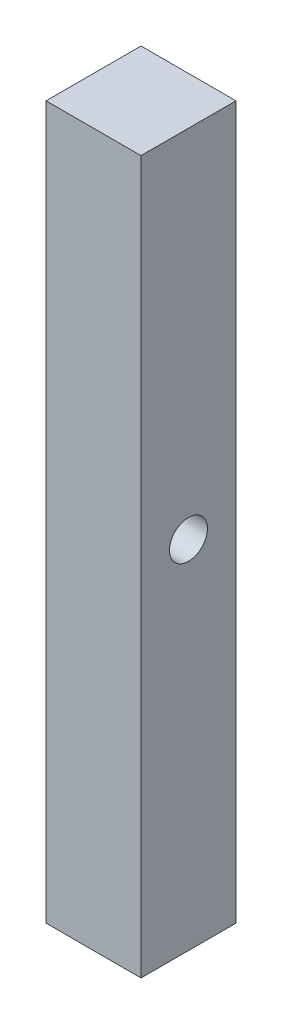
ISO-10303-21;
HEADER;
FILE_DESCRIPTION(('STEP AP214'),'2;1');
FILE_NAME('part.step','',(''),(''),'','','');
FILE_SCHEMA(('AUTOMOTIVE_DESIGN { 1 0 10303 214 1 1 1 1 }'));
ENDSEC;
DATA;
#1=APPLICATION_CONTEXT('core data for automotive mechanical design processes');
#2=APPLICATION_PROTOCOL_DEFINITION('international standard','automotive_design',2000,#1);
#3=PRODUCT_CONTEXT('',#1,'mechanical');
#4=PRODUCT('Part','Part','',(#3));
#5=PRODUCT_RELATED_PRODUCT_CATEGORY('part','',(#4));
#6=PRODUCT_DEFINITION_FORMATION('','',#4);
#7=PRODUCT_DEFINITION_CONTEXT('part definition',#1,'design');
#8=PRODUCT_DEFINITION('design','',#6,#7);
#9=PRODUCT_DEFINITION_SHAPE('','',#8);
#10=(LENGTH_UNIT() NAMED_UNIT(*) SI_UNIT(.MILLI.,.METRE.));
#11=(NAMED_UNIT(*) PLANE_ANGLE_UNIT() SI_UNIT($,.RADIAN.));
#12=(NAMED_UNIT(*) SI_UNIT($,.STERADIAN.) SOLID_ANGLE_UNIT());
#13=UNCERTAINTY_MEASURE_WITH_UNIT(LENGTH_MEASURE(1.E-05),#10,'distance_accuracy_value','');
#14=(GEOMETRIC_REPRESENTATION_CONTEXT(3) GLOBAL_UNCERTAINTY_ASSIGNED_CONTEXT((#13)) GLOBAL_UNIT_ASSIGNED_CONTEXT((#10,
#11,#12)) REPRESENTATION_CONTEXT('',''));
#15=CARTESIAN_POINT('',(0.,0.,0.));
#16=DIRECTION('',(0.,0.,1.));
#17=DIRECTION('',(1.,0.,0.));
#18=AXIS2_PLACEMENT_3D('',#15,#16,#17);
#19=CARTESIAN_POINT('',(10.,150.,-10.));
#20=DIRECTION('',(-1.,0.,0.));
#21=DIRECTION('',(0.,0.,1.));
#22=AXIS2_PLACEMENT_3D('',#19,#20,#21);
#23=PLANE('',#22);
#24=CARTESIAN_POINT('',(10.,75.,0.));
#25=DIRECTION('',(-1.,0.,0.));
#26=DIRECTION('',(0.,0.,1.));
#27=AXIS2_PLACEMENT_3D('',#24,#25,#26);
#28=CIRCLE('',#27,4.);
#29=CARTESIAN_POINT('',(10.,75.,4.));
#30=VERTEX_POINT('',#29);
#31=EDGE_CURVE('E98',#30,#30,#28,.T.);
#32=ORIENTED_EDGE('',*,*,#31,.T.);
#33=EDGE_LOOP('',(#32));
#34=FACE_BOUND('',#33,.T.);
#35=DIRECTION('',(0.,0.,-1.));
#36=VECTOR('',#35,1.);
#37=CARTESIAN_POINT('',(10.,0.,-10.));
#38=LINE('',#37,#36);
#39=CARTESIAN_POINT('',(10.,0.,10.));
#40=VERTEX_POINT('',#39);
#41=CARTESIAN_POINT('',(10.,0.,-10.));
#42=VERTEX_POINT('',#41);
#43=EDGE_CURVE('E95',#40,#42,#38,.T.);
#44=ORIENTED_EDGE('',*,*,#43,.T.);
#45=DIRECTION('',(0.,-1.,0.));
#46=VECTOR('',#45,1.);
#47=CARTESIAN_POINT('',(10.,150.,-10.));
#48=LINE('',#47,#46);
#49=CARTESIAN_POINT('',(10.,150.,-10.));
#50=VERTEX_POINT('',#49);
#51=EDGE_CURVE('E11',#50,#42,#48,.T.);
#52=ORIENTED_EDGE('',*,*,#51,.F.);
#53=DIRECTION('',(0.,0.,-1.));
#54=VECTOR('',#53,1.);
#55=CARTESIAN_POINT('',(10.,150.,-10.));
#56=LINE('',#55,#54);
#57=CARTESIAN_POINT('',(10.,150.,10.));
#58=VERTEX_POINT('',#57);
#59=EDGE_CURVE('E83',#58,#50,#56,.T.);
#60=ORIENTED_EDGE('',*,*,#59,.F.);
#61=DIRECTION('',(0.,-1.,0.));
#62=VECTOR('',#61,1.);
#63=CARTESIAN_POINT('',(10.,150.,10.));
#64=LINE('',#63,#62);
#65=EDGE_CURVE('E91',#58,#40,#64,.T.);
#66=ORIENTED_EDGE('',*,*,#65,.T.);
#67=EDGE_LOOP('',(#44,#52,#60,#66));
#68=FACE_BOUND('',#67,.T.);
#69=ADVANCED_FACE('F32',(#34,#68),#23,.F.);
#70=CARTESIAN_POINT('',(-10.,150.,-10.));
#71=DIRECTION('',(0.,0.,1.));
#72=DIRECTION('',(1.,0.,0.));
#73=AXIS2_PLACEMENT_3D('',#70,#71,#72);
#74=PLANE('',#73);
#75=DIRECTION('',(-1.,0.,0.));
#76=VECTOR('',#75,1.);
#77=CARTESIAN_POINT('',(-10.,0.,-10.));
#78=LINE('',#77,#76);
#79=CARTESIAN_POINT('',(-10.,0.,-10.));
#80=VERTEX_POINT('',#79);
#81=EDGE_CURVE('E87',#42,#80,#78,.T.);
#82=ORIENTED_EDGE('',*,*,#81,.T.);
#83=DIRECTION('',(0.,-1.,0.));
#84=VECTOR('',#83,1.);
#85=CARTESIAN_POINT('',(-10.,150.,-10.));
#86=LINE('',#85,#84);
#87=CARTESIAN_POINT('',(-10.,150.,-10.));
#88=VERTEX_POINT('',#87);
#89=EDGE_CURVE('E40',#88,#80,#86,.T.);
#90=ORIENTED_EDGE('',*,*,#89,.F.);
#91=DIRECTION('',(-1.,0.,0.));
#92=VECTOR('',#91,1.);
#93=CARTESIAN_POINT('',(-10.,150.,-10.));
#94=LINE('',#93,#92);
#95=EDGE_CURVE('E78',#50,#88,#94,.T.);
#96=ORIENTED_EDGE('',*,*,#95,.F.);
#97=ORIENTED_EDGE('',*,*,#51,.T.);
#98=EDGE_LOOP('',(#82,#90,#96,#97));
#99=FACE_BOUND('',#98,.T.);
#100=ADVANCED_FACE('F86',(#99),#74,.F.);
#101=CARTESIAN_POINT('',(-10.,150.,-10.));
#102=DIRECTION('',(1.,0.,0.));
#103=DIRECTION('',(0.,0.,-1.));
#104=AXIS2_PLACEMENT_3D('',#101,#102,#103);
#105=PLANE('',#104);
#106=CARTESIAN_POINT('',(-10.,75.,0.));
#107=DIRECTION('',(1.,0.,0.));
#108=DIRECTION('',(0.,0.,-1.));
#109=AXIS2_PLACEMENT_3D('',#106,#107,#108);
#110=CIRCLE('',#109,4.);
#111=CARTESIAN_POINT('',(-10.,75.,-4.));
#112=VERTEX_POINT('',#111);
#113=EDGE_CURVE('E111',#112,#112,#110,.T.);
#114=ORIENTED_EDGE('',*,*,#113,.T.);
#115=EDGE_LOOP('',(#114));
#116=FACE_BOUND('',#115,.T.);
#117=DIRECTION('',(0.,0.,1.));
#118=VECTOR('',#117,1.);
#119=CARTESIAN_POINT('',(-10.,0.,-10.));
#120=LINE('',#119,#118);
#121=CARTESIAN_POINT('',(-10.,0.,10.));
#122=VERTEX_POINT('',#121);
#123=EDGE_CURVE('E65',#80,#122,#120,.T.);
#124=ORIENTED_EDGE('',*,*,#123,.T.);
#125=DIRECTION('',(0.,-1.,0.));
#126=VECTOR('',#125,1.);
#127=CARTESIAN_POINT('',(-10.,150.,10.));
#128=LINE('',#127,#126);
#129=CARTESIAN_POINT('',(-10.,150.,10.));
#130=VERTEX_POINT('',#129);
#131=EDGE_CURVE('E88',#130,#122,#128,.T.);
#132=ORIENTED_EDGE('',*,*,#131,.F.);
#133=DIRECTION('',(0.,0.,1.));
#134=VECTOR('',#133,1.);
#135=CARTESIAN_POINT('',(-10.,150.,-10.));
#136=LINE('',#135,#134);
#137=EDGE_CURVE('E81',#88,#130,#136,.T.);
#138=ORIENTED_EDGE('',*,*,#137,.F.);
#139=ORIENTED_EDGE('',*,*,#89,.T.);
#140=EDGE_LOOP('',(#124,#132,#138,#139));
#141=FACE_BOUND('',#140,.T.);
#142=ADVANCED_FACE('F89',(#116,#141),#105,.F.);
#143=CARTESIAN_POINT('',(-10.,150.,10.));
#144=DIRECTION('',(0.,0.,-1.));
#145=DIRECTION('',(-1.,0.,0.));
#146=AXIS2_PLACEMENT_3D('',#143,#144,#145);
#147=PLANE('',#146);
#148=DIRECTION('',(1.,0.,0.));
#149=VECTOR('',#148,1.);
#150=CARTESIAN_POINT('',(-10.,0.,10.));
#151=LINE('',#150,#149);
#152=EDGE_CURVE('E71',#122,#40,#151,.T.);
#153=ORIENTED_EDGE('',*,*,#152,.T.);
#154=ORIENTED_EDGE('',*,*,#65,.F.);
#155=DIRECTION('',(1.,0.,0.));
#156=VECTOR('',#155,1.);
#157=CARTESIAN_POINT('',(-10.,150.,10.));
#158=LINE('',#157,#156);
#159=EDGE_CURVE('E48',#130,#58,#158,.T.);
#160=ORIENTED_EDGE('',*,*,#159,.F.);
#161=ORIENTED_EDGE('',*,*,#131,.T.);
#162=EDGE_LOOP('',(#153,#154,#160,#161));
#163=FACE_BOUND('',#162,.T.);
#164=ADVANCED_FACE('F103',(#163),#147,.F.);
#165=CARTESIAN_POINT('',(0.,150.,0.));
#166=DIRECTION('',(0.,1.,0.));
#167=DIRECTION('',(0.,0.,1.));
#168=AXIS2_PLACEMENT_3D('',#165,#166,#167);
#169=PLANE('',#168);
#170=ORIENTED_EDGE('',*,*,#59,.T.);
#171=ORIENTED_EDGE('',*,*,#95,.T.);
#172=ORIENTED_EDGE('',*,*,#137,.T.);
#173=ORIENTED_EDGE('',*,*,#159,.T.);
#174=EDGE_LOOP('',(#170,#171,#172,#173));
#175=FACE_BOUND('',#174,.T.);
#176=ADVANCED_FACE('F79',(#175),#169,.T.);
#177=CARTESIAN_POINT('',(0.,0.,0.));
#178=DIRECTION('',(0.,1.,0.));
#179=DIRECTION('',(0.,0.,1.));
#180=AXIS2_PLACEMENT_3D('',#177,#178,#179);
#181=PLANE('',#180);
#182=ORIENTED_EDGE('',*,*,#43,.F.);
#183=ORIENTED_EDGE('',*,*,#152,.F.);
#184=ORIENTED_EDGE('',*,*,#123,.F.);
#185=ORIENTED_EDGE('',*,*,#81,.F.);
#186=EDGE_LOOP('',(#182,#183,#184,#185));
#187=FACE_BOUND('',#186,.T.);
#188=ADVANCED_FACE('F106',(#187),#181,.F.);
#189=CARTESIAN_POINT('',(-10.,75.,0.));
#190=DIRECTION('',(1.,0.,0.));
#191=DIRECTION('',(0.,0.,-1.));
#192=AXIS2_PLACEMENT_3D('',#189,#190,#191);
#193=CYLINDRICAL_SURFACE('',#192,4.);
#194=ORIENTED_EDGE('',*,*,#113,.F.);
#195=EDGE_LOOP('',(#194));
#196=FACE_BOUND('',#195,.T.);
#197=ORIENTED_EDGE('',*,*,#31,.F.);
#198=EDGE_LOOP('',(#197));
#199=FACE_BOUND('',#198,.T.);
#200=ADVANCED_FACE('F116',(#196,#199),#193,.F.);
#201=CLOSED_SHELL('',(#69,#100,#142,#164,#176,#188,#200));
#202=MANIFOLD_SOLID_BREP('B2',#201);
#203=ADVANCED_BREP_SHAPE_REPRESENTATION('',(#18,#202),#14);
#204=SHAPE_DEFINITION_REPRESENTATION(#9,#203);
ENDSEC;
END-ISO-10303-21;
